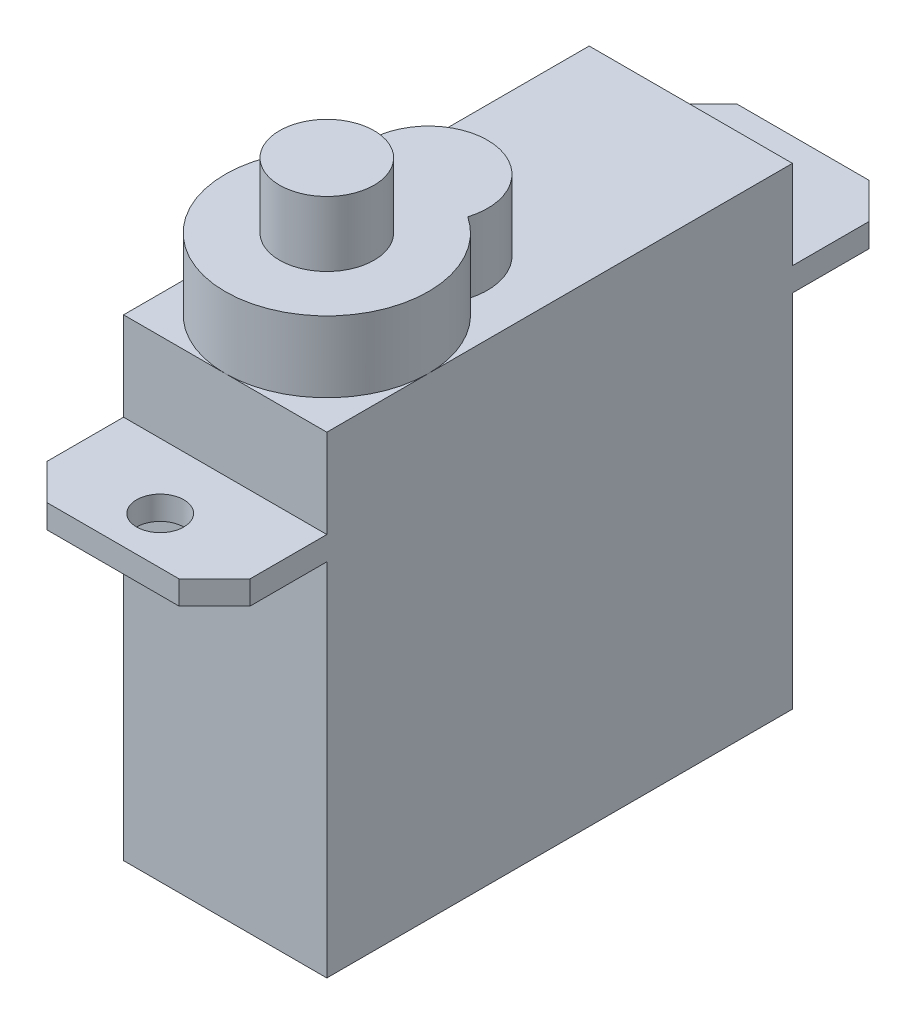
ISO-10303-21;
HEADER;
FILE_DESCRIPTION(('STEP AP214'),'2;1');
FILE_NAME('part.step','',(''),(''),'','','');
FILE_SCHEMA(('AUTOMOTIVE_DESIGN { 1 0 10303 214 1 1 1 1 }'));
ENDSEC;
DATA;
#1=APPLICATION_CONTEXT('core data for automotive mechanical design processes');
#2=APPLICATION_PROTOCOL_DEFINITION('international standard','automotive_design',2000,#1);
#3=PRODUCT_CONTEXT('',#1,'mechanical');
#4=PRODUCT('Part','Part','',(#3));
#5=PRODUCT_RELATED_PRODUCT_CATEGORY('part','',(#4));
#6=PRODUCT_DEFINITION_FORMATION('','',#4);
#7=PRODUCT_DEFINITION_CONTEXT('part definition',#1,'design');
#8=PRODUCT_DEFINITION('design','',#6,#7);
#9=PRODUCT_DEFINITION_SHAPE('','',#8);
#10=(LENGTH_UNIT() NAMED_UNIT(*) SI_UNIT(.MILLI.,.METRE.));
#11=(NAMED_UNIT(*) PLANE_ANGLE_UNIT() SI_UNIT($,.RADIAN.));
#12=(NAMED_UNIT(*) SI_UNIT($,.STERADIAN.) SOLID_ANGLE_UNIT());
#13=UNCERTAINTY_MEASURE_WITH_UNIT(LENGTH_MEASURE(1.E-05),#10,'distance_accuracy_value','');
#14=(GEOMETRIC_REPRESENTATION_CONTEXT(3) GLOBAL_UNCERTAINTY_ASSIGNED_CONTEXT((#13)) GLOBAL_UNIT_ASSIGNED_CONTEXT((#10,
#11,#12)) REPRESENTATION_CONTEXT('',''));
#15=CARTESIAN_POINT('',(0.,0.,0.));
#16=DIRECTION('',(0.,0.,1.));
#17=DIRECTION('',(1.,0.,0.));
#18=AXIS2_PLACEMENT_3D('',#15,#16,#17);
#19=CARTESIAN_POINT('',(8.6,-4.75,-9.85));
#20=DIRECTION('',(0.,1.,0.));
#21=DIRECTION('',(0.,0.,1.));
#22=AXIS2_PLACEMENT_3D('',#19,#20,#21);
#23=PLANE('',#22);
#24=DIRECTION('',(0.,0.,-1.));
#25=VECTOR('',#24,1.);
#26=CARTESIAN_POINT('',(0.,-4.75,-9.85));
#27=LINE('',#26,#25);
#28=CARTESIAN_POINT('',(0.,-4.75,-9.85));
#29=VERTEX_POINT('',#28);
#30=CARTESIAN_POINT('',(0.,-4.75,-13.1));
#31=VERTEX_POINT('',#30);
#32=EDGE_CURVE('E234',#29,#31,#27,.T.);
#33=ORIENTED_EDGE('',*,*,#32,.T.);
#34=DIRECTION('',(-0.707106781186546,0.,0.707106781186549));
#35=VECTOR('',#34,1.);
#36=CARTESIAN_POINT('',(1.5,-4.75,-14.6));
#37=LINE('',#36,#35);
#38=CARTESIAN_POINT('',(1.5,-4.75,-14.6));
#39=VERTEX_POINT('',#38);
#40=EDGE_CURVE('E296',#31,#39,#37,.F.);
#41=ORIENTED_EDGE('',*,*,#40,.T.);
#42=DIRECTION('',(-1.,0.,0.));
#43=VECTOR('',#42,1.);
#44=CARTESIAN_POINT('',(8.6,-4.75,-14.6));
#45=LINE('',#44,#43);
#46=CARTESIAN_POINT('',(7.1,-4.75,-14.6));
#47=VERTEX_POINT('',#46);
#48=EDGE_CURVE('E256',#47,#39,#45,.T.);
#49=ORIENTED_EDGE('',*,*,#48,.F.);
#50=DIRECTION('',(0.707106781186548,0.,0.707106781186547));
#51=VECTOR('',#50,1.);
#52=CARTESIAN_POINT('',(8.6,-4.75,-13.1));
#53=LINE('',#52,#51);
#54=CARTESIAN_POINT('',(8.6,-4.75,-13.1));
#55=VERTEX_POINT('',#54);
#56=EDGE_CURVE('E294',#47,#55,#53,.T.);
#57=ORIENTED_EDGE('',*,*,#56,.T.);
#58=DIRECTION('',(0.,0.,-1.));
#59=VECTOR('',#58,1.);
#60=CARTESIAN_POINT('',(8.6,-4.75,-9.85));
#61=LINE('',#60,#59);
#62=CARTESIAN_POINT('',(8.6,-4.75,-9.85));
#63=VERTEX_POINT('',#62);
#64=EDGE_CURVE('E213',#63,#55,#61,.T.);
#65=ORIENTED_EDGE('',*,*,#64,.F.);
#66=DIRECTION('',(-1.,0.,0.));
#67=VECTOR('',#66,1.);
#68=CARTESIAN_POINT('',(8.6,-4.75,-9.85));
#69=LINE('',#68,#67);
#70=EDGE_CURVE('E259',#63,#29,#69,.T.);
#71=ORIENTED_EDGE('',*,*,#70,.T.);
#72=EDGE_LOOP('',(#33,#41,#49,#57,#65,#71));
#73=FACE_BOUND('',#72,.T.);
#74=CARTESIAN_POINT('',(4.3,-4.75,-12.6));
#75=DIRECTION('',(0.,1.,0.));
#76=DIRECTION('',(0.,0.,1.));
#77=AXIS2_PLACEMENT_3D('',#74,#75,#76);
#78=CIRCLE('',#77,1.);
#79=CARTESIAN_POINT('',(4.3,-4.75,-11.6));
#80=VERTEX_POINT('',#79);
#81=EDGE_CURVE('E440',#80,#80,#78,.T.);
#82=ORIENTED_EDGE('',*,*,#81,.T.);
#83=EDGE_LOOP('',(#82));
#84=FACE_BOUND('',#83,.T.);
#85=ADVANCED_FACE('F35',(#73,#84),#23,.F.);
#86=CARTESIAN_POINT('',(8.6,-3.75,-9.85));
#87=DIRECTION('',(0.,-1.,0.));
#88=DIRECTION('',(0.,0.,-1.));
#89=AXIS2_PLACEMENT_3D('',#86,#87,#88);
#90=PLANE('',#89);
#91=DIRECTION('',(-1.,0.,0.));
#92=VECTOR('',#91,1.);
#93=CARTESIAN_POINT('',(8.6,-3.75,-14.6));
#94=LINE('',#93,#92);
#95=CARTESIAN_POINT('',(7.1,-3.75,-14.6));
#96=VERTEX_POINT('',#95);
#97=CARTESIAN_POINT('',(1.5,-3.75,-14.6));
#98=VERTEX_POINT('',#97);
#99=EDGE_CURVE('E253',#96,#98,#94,.T.);
#100=ORIENTED_EDGE('',*,*,#99,.T.);
#101=DIRECTION('',(0.707106781186546,0.,-0.707106781186549));
#102=VECTOR('',#101,1.);
#103=CARTESIAN_POINT('',(1.5,-3.75,-14.6));
#104=LINE('',#103,#102);
#105=CARTESIAN_POINT('',(0.,-3.75,-13.1));
#106=VERTEX_POINT('',#105);
#107=EDGE_CURVE('E288',#98,#106,#104,.F.);
#108=ORIENTED_EDGE('',*,*,#107,.T.);
#109=DIRECTION('',(0.,0.,1.));
#110=VECTOR('',#109,1.);
#111=CARTESIAN_POINT('',(0.,-3.75,-9.85));
#112=LINE('',#111,#110);
#113=CARTESIAN_POINT('',(0.,-3.75,-9.85));
#114=VERTEX_POINT('',#113);
#115=EDGE_CURVE('E237',#106,#114,#112,.T.);
#116=ORIENTED_EDGE('',*,*,#115,.T.);
#117=DIRECTION('',(-1.,0.,0.));
#118=VECTOR('',#117,1.);
#119=CARTESIAN_POINT('',(8.6,-3.75,-9.85));
#120=LINE('',#119,#118);
#121=CARTESIAN_POINT('',(8.6,-3.75,-9.85));
#122=VERTEX_POINT('',#121);
#123=EDGE_CURVE('E250',#122,#114,#120,.T.);
#124=ORIENTED_EDGE('',*,*,#123,.F.);
#125=DIRECTION('',(0.,0.,1.));
#126=VECTOR('',#125,1.);
#127=CARTESIAN_POINT('',(8.6,-3.75,-9.85));
#128=LINE('',#127,#126);
#129=CARTESIAN_POINT('',(8.6,-3.75,-13.1));
#130=VERTEX_POINT('',#129);
#131=EDGE_CURVE('E216',#130,#122,#128,.T.);
#132=ORIENTED_EDGE('',*,*,#131,.F.);
#133=DIRECTION('',(-0.707106781186548,0.,-0.707106781186547));
#134=VECTOR('',#133,1.);
#135=CARTESIAN_POINT('',(8.6,-3.75,-13.1));
#136=LINE('',#135,#134);
#137=EDGE_CURVE('E286',#130,#96,#136,.T.);
#138=ORIENTED_EDGE('',*,*,#137,.T.);
#139=EDGE_LOOP('',(#100,#108,#116,#124,#132,#138));
#140=FACE_BOUND('',#139,.T.);
#141=CARTESIAN_POINT('',(4.3,-3.75,-12.6));
#142=DIRECTION('',(0.,-1.,0.));
#143=DIRECTION('',(0.,0.,-1.));
#144=AXIS2_PLACEMENT_3D('',#141,#142,#143);
#145=CIRCLE('',#144,1.);
#146=CARTESIAN_POINT('',(4.3,-3.75,-13.6));
#147=VERTEX_POINT('',#146);
#148=EDGE_CURVE('E439',#147,#147,#145,.T.);
#149=ORIENTED_EDGE('',*,*,#148,.T.);
#150=EDGE_LOOP('',(#149));
#151=FACE_BOUND('',#150,.T.);
#152=ADVANCED_FACE('F346',(#140,#151),#90,.F.);
#153=CARTESIAN_POINT('',(4.3,3.,3.4));
#154=DIRECTION('',(0.,1.,0.));
#155=DIRECTION('',(0.,0.,1.));
#156=AXIS2_PLACEMENT_3D('',#153,#154,#155);
#157=PLANE('',#156);
#158=CARTESIAN_POINT('',(4.3,3.,1.25));
#159=DIRECTION('',(0.,1.,0.));
#160=DIRECTION('',(0.,0.,1.));
#161=AXIS2_PLACEMENT_3D('',#158,#159,#160);
#162=CIRCLE('',#161,2.5);
#163=CARTESIAN_POINT('',(6.69203739269427,3.,1.97674418604651));
#164=VERTEX_POINT('',#163);
#165=CARTESIAN_POINT('',(1.90796260730573,3.,1.97674418604651));
#166=VERTEX_POINT('',#165);
#167=EDGE_CURVE('E181',#164,#166,#162,.T.);
#168=ORIENTED_EDGE('',*,*,#167,.T.);
#169=CARTESIAN_POINT('',(4.3,3.,5.55));
#170=DIRECTION('',(0.,1.,0.));
#171=DIRECTION('',(0.,0.,1.));
#172=AXIS2_PLACEMENT_3D('',#169,#170,#171);
#173=CIRCLE('',#172,4.3);
#174=EDGE_CURVE('E169',#166,#164,#173,.T.);
#175=ORIENTED_EDGE('',*,*,#174,.T.);
#176=EDGE_LOOP('',(#168,#175));
#177=FACE_BOUND('',#176,.T.);
#178=CARTESIAN_POINT('',(4.3,3.,5.55));
#179=DIRECTION('',(0.,1.,0.));
#180=DIRECTION('',(0.,0.,1.));
#181=AXIS2_PLACEMENT_3D('',#178,#179,#180);
#182=CIRCLE('',#181,2.);
#183=CARTESIAN_POINT('',(4.3,3.,7.55));
#184=VERTEX_POINT('',#183);
#185=EDGE_CURVE('E428',#184,#184,#182,.T.);
#186=ORIENTED_EDGE('',*,*,#185,.F.);
#187=EDGE_LOOP('',(#186));
#188=FACE_BOUND('',#187,.T.);
#189=ADVANCED_FACE('F183',(#177,#188),#157,.T.);
#190=CARTESIAN_POINT('',(8.6,0.,9.85));
#191=DIRECTION('',(0.,-1.,0.));
#192=DIRECTION('',(0.,0.,-1.));
#193=AXIS2_PLACEMENT_3D('',#190,#191,#192);
#194=PLANE('',#193);
#195=CARTESIAN_POINT('',(4.3,0.,1.25));
#196=DIRECTION('',(0.,1.,0.));
#197=DIRECTION('',(0.,0.,1.));
#198=AXIS2_PLACEMENT_3D('',#195,#196,#197);
#199=CIRCLE('',#198,2.5);
#200=CARTESIAN_POINT('',(6.69203739269427,0.,1.97674418604651));
#201=VERTEX_POINT('',#200);
#202=CARTESIAN_POINT('',(1.90796260730573,0.,1.97674418604651));
#203=VERTEX_POINT('',#202);
#204=EDGE_CURVE('E189',#201,#203,#199,.T.);
#205=ORIENTED_EDGE('',*,*,#204,.F.);
#206=CARTESIAN_POINT('',(4.3,0.,5.55));
#207=DIRECTION('',(0.,1.,0.));
#208=DIRECTION('',(0.,0.,1.));
#209=AXIS2_PLACEMENT_3D('',#206,#207,#208);
#210=CIRCLE('',#209,4.3);
#211=CARTESIAN_POINT('',(8.6,0.,5.55));
#212=VERTEX_POINT('',#211);
#213=EDGE_CURVE('E279',#212,#201,#210,.T.);
#214=ORIENTED_EDGE('',*,*,#213,.F.);
#215=DIRECTION('',(0.,0.,1.));
#216=VECTOR('',#215,1.);
#217=CARTESIAN_POINT('',(8.6,0.,9.85));
#218=LINE('',#217,#216);
#219=CARTESIAN_POINT('',(8.6,0.,-9.85));
#220=VERTEX_POINT('',#219);
#221=EDGE_CURVE('E221',#220,#212,#218,.T.);
#222=ORIENTED_EDGE('',*,*,#221,.F.);
#223=DIRECTION('',(-1.,0.,0.));
#224=VECTOR('',#223,1.);
#225=CARTESIAN_POINT('',(8.6,0.,-9.85));
#226=LINE('',#225,#224);
#227=CARTESIAN_POINT('',(0.,0.,-9.85));
#228=VERTEX_POINT('',#227);
#229=EDGE_CURVE('E247',#220,#228,#226,.T.);
#230=ORIENTED_EDGE('',*,*,#229,.T.);
#231=DIRECTION('',(0.,0.,1.));
#232=VECTOR('',#231,1.);
#233=CARTESIAN_POINT('',(0.,0.,9.85));
#234=LINE('',#233,#232);
#235=CARTESIAN_POINT('',(0.,0.,5.55));
#236=VERTEX_POINT('',#235);
#237=EDGE_CURVE('E202',#228,#236,#234,.T.);
#238=ORIENTED_EDGE('',*,*,#237,.T.);
#239=EDGE_CURVE('E186',#203,#236,#210,.T.);
#240=ORIENTED_EDGE('',*,*,#239,.F.);
#241=EDGE_LOOP('',(#205,#214,#222,#230,#238,#240));
#242=FACE_BOUND('',#241,.T.);
#243=ADVANCED_FACE('F418',(#242),#194,.F.);
#244=CARTESIAN_POINT('',(4.3,0.,9.85));
#245=VERTEX_POINT('',#244);
#246=EDGE_CURVE('E283',#236,#245,#210,.T.);
#247=ORIENTED_EDGE('',*,*,#246,.F.);
#248=CARTESIAN_POINT('',(0.,0.,9.85));
#249=VERTEX_POINT('',#248);
#250=EDGE_CURVE('E241',#236,#249,#234,.T.);
#251=ORIENTED_EDGE('',*,*,#250,.T.);
#252=DIRECTION('',(-1.,0.,0.));
#253=VECTOR('',#252,1.);
#254=CARTESIAN_POINT('',(8.6,0.,9.85));
#255=LINE('',#254,#253);
#256=EDGE_CURVE('E223',#245,#249,#255,.T.);
#257=ORIENTED_EDGE('',*,*,#256,.F.);
#258=EDGE_LOOP('',(#247,#251,#257));
#259=FACE_BOUND('',#258,.T.);
#260=ADVANCED_FACE('F477',(#259),#194,.F.);
#261=EDGE_CURVE('E420',#245,#212,#210,.T.);
#262=ORIENTED_EDGE('',*,*,#261,.F.);
#263=CARTESIAN_POINT('',(8.6,0.,9.85));
#264=VERTEX_POINT('',#263);
#265=EDGE_CURVE('E244',#264,#245,#255,.T.);
#266=ORIENTED_EDGE('',*,*,#265,.F.);
#267=EDGE_CURVE('E220',#212,#264,#218,.T.);
#268=ORIENTED_EDGE('',*,*,#267,.F.);
#269=EDGE_LOOP('',(#262,#266,#268));
#270=FACE_BOUND('',#269,.T.);
#271=ADVANCED_FACE('F380',(#270),#194,.F.);
#272=CARTESIAN_POINT('',(8.6,0.,9.85));
#273=DIRECTION('',(0.,0.,-1.));
#274=DIRECTION('',(0.,1.,0.));
#275=AXIS2_PLACEMENT_3D('',#272,#273,#274);
#276=PLANE('',#275);
#277=DIRECTION('',(0.,-1.,0.));
#278=VECTOR('',#277,1.);
#279=CARTESIAN_POINT('',(0.,0.,9.85));
#280=LINE('',#279,#278);
#281=CARTESIAN_POINT('',(0.,-3.75,9.85));
#282=VERTEX_POINT('',#281);
#283=EDGE_CURVE('E190',#249,#282,#280,.T.);
#284=ORIENTED_EDGE('',*,*,#283,.T.);
#285=DIRECTION('',(-1.,0.,0.));
#286=VECTOR('',#285,1.);
#287=CARTESIAN_POINT('',(8.6,-3.75,9.85));
#288=LINE('',#287,#286);
#289=CARTESIAN_POINT('',(8.6,-3.75,9.85));
#290=VERTEX_POINT('',#289);
#291=EDGE_CURVE('E276',#290,#282,#288,.T.);
#292=ORIENTED_EDGE('',*,*,#291,.F.);
#293=DIRECTION('',(0.,-1.,0.));
#294=VECTOR('',#293,1.);
#295=CARTESIAN_POINT('',(8.6,0.,9.85));
#296=LINE('',#295,#294);
#297=EDGE_CURVE('E198',#264,#290,#296,.T.);
#298=ORIENTED_EDGE('',*,*,#297,.F.);
#299=ORIENTED_EDGE('',*,*,#265,.T.);
#300=ORIENTED_EDGE('',*,*,#256,.T.);
#301=EDGE_LOOP('',(#284,#292,#298,#299,#300));
#302=FACE_BOUND('',#301,.T.);
#303=ADVANCED_FACE('F330',(#302),#276,.F.);
#304=CARTESIAN_POINT('',(8.6,-3.75,14.6));
#305=DIRECTION('',(0.,-1.,0.));
#306=DIRECTION('',(0.,0.,-1.));
#307=AXIS2_PLACEMENT_3D('',#304,#305,#306);
#308=PLANE('',#307);
#309=CARTESIAN_POINT('',(4.3,-3.75,12.6));
#310=DIRECTION('',(0.,1.,0.));
#311=DIRECTION('',(0.,0.,1.));
#312=AXIS2_PLACEMENT_3D('',#309,#310,#311);
#313=CIRCLE('',#312,1.);
#314=CARTESIAN_POINT('',(4.3,-3.75,13.6));
#315=VERTEX_POINT('',#314);
#316=EDGE_CURVE('E436',#315,#315,#313,.T.);
#317=ORIENTED_EDGE('',*,*,#316,.F.);
#318=EDGE_LOOP('',(#317));
#319=FACE_BOUND('',#318,.T.);
#320=DIRECTION('',(-1.,0.,0.));
#321=VECTOR('',#320,1.);
#322=CARTESIAN_POINT('',(8.6,-3.75,14.6));
#323=LINE('',#322,#321);
#324=CARTESIAN_POINT('',(7.1,-3.75,14.6));
#325=VERTEX_POINT('',#324);
#326=CARTESIAN_POINT('',(1.5,-3.75,14.6));
#327=VERTEX_POINT('',#326);
#328=EDGE_CURVE('E274',#325,#327,#323,.T.);
#329=ORIENTED_EDGE('',*,*,#328,.F.);
#330=DIRECTION('',(0.707106781186548,0.,-0.707106781186547));
#331=VECTOR('',#330,1.);
#332=CARTESIAN_POINT('',(8.6,-3.75,13.1));
#333=LINE('',#332,#331);
#334=CARTESIAN_POINT('',(8.6,-3.75,13.1));
#335=VERTEX_POINT('',#334);
#336=EDGE_CURVE('E11',#325,#335,#333,.T.);
#337=ORIENTED_EDGE('',*,*,#336,.T.);
#338=DIRECTION('',(0.,0.,1.));
#339=VECTOR('',#338,1.);
#340=CARTESIAN_POINT('',(8.6,-3.75,14.6));
#341=LINE('',#340,#339);
#342=EDGE_CURVE('E201',#290,#335,#341,.T.);
#343=ORIENTED_EDGE('',*,*,#342,.F.);
#344=ORIENTED_EDGE('',*,*,#291,.T.);
#345=DIRECTION('',(0.,0.,1.));
#346=VECTOR('',#345,1.);
#347=CARTESIAN_POINT('',(0.,-3.75,14.6));
#348=LINE('',#347,#346);
#349=CARTESIAN_POINT('',(0.,-3.75,13.1));
#350=VERTEX_POINT('',#349);
#351=EDGE_CURVE('E193',#282,#350,#348,.T.);
#352=ORIENTED_EDGE('',*,*,#351,.T.);
#353=DIRECTION('',(-0.707106781186546,0.,-0.707106781186549));
#354=VECTOR('',#353,1.);
#355=CARTESIAN_POINT('',(1.5,-3.75,14.6));
#356=LINE('',#355,#354);
#357=EDGE_CURVE('E43',#350,#327,#356,.F.);
#358=ORIENTED_EDGE('',*,*,#357,.T.);
#359=EDGE_LOOP('',(#329,#337,#343,#344,#352,#358));
#360=FACE_BOUND('',#359,.T.);
#361=ADVANCED_FACE('F327',(#319,#360),#308,.F.);
#362=CARTESIAN_POINT('',(8.6,-3.75,14.6));
#363=DIRECTION('',(0.,0.,-1.));
#364=DIRECTION('',(-1.,0.,0.));
#365=AXIS2_PLACEMENT_3D('',#362,#363,#364);
#366=PLANE('',#365);
#367=DIRECTION('',(-1.,0.,0.));
#368=VECTOR('',#367,1.);
#369=CARTESIAN_POINT('',(8.6,-4.75,14.6));
#370=LINE('',#369,#368);
#371=CARTESIAN_POINT('',(7.1,-4.75,14.6));
#372=VERTEX_POINT('',#371);
#373=CARTESIAN_POINT('',(1.5,-4.75,14.6));
#374=VERTEX_POINT('',#373);
#375=EDGE_CURVE('E271',#372,#374,#370,.T.);
#376=ORIENTED_EDGE('',*,*,#375,.F.);
#377=DIRECTION('',(0.,1.,0.));
#378=VECTOR('',#377,1.);
#379=CARTESIAN_POINT('',(7.1,-3.75,14.6));
#380=LINE('',#379,#378);
#381=EDGE_CURVE('E56',#372,#325,#380,.T.);
#382=ORIENTED_EDGE('',*,*,#381,.T.);
#383=ORIENTED_EDGE('',*,*,#328,.T.);
#384=DIRECTION('',(0.,-1.,0.));
#385=VECTOR('',#384,1.);
#386=CARTESIAN_POINT('',(1.5,-3.75,14.6));
#387=LINE('',#386,#385);
#388=EDGE_CURVE('E308',#327,#374,#387,.T.);
#389=ORIENTED_EDGE('',*,*,#388,.T.);
#390=EDGE_LOOP('',(#376,#382,#383,#389));
#391=FACE_BOUND('',#390,.T.);
#392=ADVANCED_FACE('F312',(#391),#366,.F.);
#393=CARTESIAN_POINT('',(8.6,-4.75,14.6));
#394=DIRECTION('',(0.,1.,0.));
#395=DIRECTION('',(0.,0.,1.));
#396=AXIS2_PLACEMENT_3D('',#393,#394,#395);
#397=PLANE('',#396);
#398=CARTESIAN_POINT('',(4.3,-4.75,12.6));
#399=DIRECTION('',(0.,1.,0.));
#400=DIRECTION('',(0.,0.,1.));
#401=AXIS2_PLACEMENT_3D('',#398,#399,#400);
#402=CIRCLE('',#401,1.);
#403=CARTESIAN_POINT('',(4.3,-4.75,13.6));
#404=VERTEX_POINT('',#403);
#405=EDGE_CURVE('E432',#404,#404,#402,.F.);
#406=ORIENTED_EDGE('',*,*,#405,.F.);
#407=EDGE_LOOP('',(#406));
#408=FACE_BOUND('',#407,.T.);
#409=DIRECTION('',(0.,0.,-1.));
#410=VECTOR('',#409,1.);
#411=CARTESIAN_POINT('',(8.6,-4.75,14.6));
#412=LINE('',#411,#410);
#413=CARTESIAN_POINT('',(8.6,-4.75,13.1));
#414=VERTEX_POINT('',#413);
#415=CARTESIAN_POINT('',(8.6,-4.75,9.85));
#416=VERTEX_POINT('',#415);
#417=EDGE_CURVE('E205',#414,#416,#412,.T.);
#418=ORIENTED_EDGE('',*,*,#417,.F.);
#419=DIRECTION('',(-0.707106781186548,0.,0.707106781186547));
#420=VECTOR('',#419,1.);
#421=CARTESIAN_POINT('',(8.6,-4.75,13.1));
#422=LINE('',#421,#420);
#423=EDGE_CURVE('E306',#414,#372,#422,.T.);
#424=ORIENTED_EDGE('',*,*,#423,.T.);
#425=ORIENTED_EDGE('',*,*,#375,.T.);
#426=DIRECTION('',(0.707106781186546,0.,0.707106781186549));
#427=VECTOR('',#426,1.);
#428=CARTESIAN_POINT('',(1.5,-4.75,14.6));
#429=LINE('',#428,#427);
#430=CARTESIAN_POINT('',(0.,-4.75,13.1));
#431=VERTEX_POINT('',#430);
#432=EDGE_CURVE('E304',#374,#431,#429,.F.);
#433=ORIENTED_EDGE('',*,*,#432,.T.);
#434=DIRECTION('',(0.,0.,-1.));
#435=VECTOR('',#434,1.);
#436=CARTESIAN_POINT('',(0.,-4.75,14.6));
#437=LINE('',#436,#435);
#438=CARTESIAN_POINT('',(0.,-4.75,9.85));
#439=VERTEX_POINT('',#438);
#440=EDGE_CURVE('E226',#431,#439,#437,.T.);
#441=ORIENTED_EDGE('',*,*,#440,.T.);
#442=DIRECTION('',(-1.,0.,0.));
#443=VECTOR('',#442,1.);
#444=CARTESIAN_POINT('',(8.6,-4.75,9.85));
#445=LINE('',#444,#443);
#446=EDGE_CURVE('E268',#416,#439,#445,.T.);
#447=ORIENTED_EDGE('',*,*,#446,.F.);
#448=EDGE_LOOP('',(#418,#424,#425,#433,#441,#447));
#449=FACE_BOUND('',#448,.T.);
#450=ADVANCED_FACE('F316',(#408,#449),#397,.F.);
#451=CARTESIAN_POINT('',(8.6,-4.75,9.85));
#452=DIRECTION('',(0.,0.,-1.));
#453=DIRECTION('',(0.,1.,0.));
#454=AXIS2_PLACEMENT_3D('',#451,#452,#453);
#455=PLANE('',#454);
#456=DIRECTION('',(0.,-1.,0.));
#457=VECTOR('',#456,1.);
#458=CARTESIAN_POINT('',(0.,-4.75,9.85));
#459=LINE('',#458,#457);
#460=CARTESIAN_POINT('',(0.,-20.,9.85));
#461=VERTEX_POINT('',#460);
#462=EDGE_CURVE('E228',#439,#461,#459,.T.);
#463=ORIENTED_EDGE('',*,*,#462,.T.);
#464=DIRECTION('',(-1.,0.,0.));
#465=VECTOR('',#464,1.);
#466=CARTESIAN_POINT('',(8.6,-20.,9.85));
#467=LINE('',#466,#465);
#468=CARTESIAN_POINT('',(8.6,-20.,9.85));
#469=VERTEX_POINT('',#468);
#470=EDGE_CURVE('E265',#469,#461,#467,.T.);
#471=ORIENTED_EDGE('',*,*,#470,.F.);
#472=DIRECTION('',(0.,-1.,0.));
#473=VECTOR('',#472,1.);
#474=CARTESIAN_POINT('',(8.6,-4.75,9.85));
#475=LINE('',#474,#473);
#476=EDGE_CURVE('E207',#416,#469,#475,.T.);
#477=ORIENTED_EDGE('',*,*,#476,.F.);
#478=ORIENTED_EDGE('',*,*,#446,.T.);
#479=EDGE_LOOP('',(#463,#471,#477,#478));
#480=FACE_BOUND('',#479,.T.);
#481=ADVANCED_FACE('F365',(#480),#455,.F.);
#482=CARTESIAN_POINT('',(8.6,-20.,9.85));
#483=DIRECTION('',(0.,1.,0.));
#484=DIRECTION('',(0.,0.,1.));
#485=AXIS2_PLACEMENT_3D('',#482,#483,#484);
#486=PLANE('',#485);
#487=DIRECTION('',(0.,0.,-1.));
#488=VECTOR('',#487,1.);
#489=CARTESIAN_POINT('',(0.,-20.,9.85));
#490=LINE('',#489,#488);
#491=CARTESIAN_POINT('',(0.,-20.,-9.85));
#492=VERTEX_POINT('',#491);
#493=EDGE_CURVE('E230',#461,#492,#490,.T.);
#494=ORIENTED_EDGE('',*,*,#493,.T.);
#495=DIRECTION('',(-1.,0.,0.));
#496=VECTOR('',#495,1.);
#497=CARTESIAN_POINT('',(8.6,-20.,-9.85));
#498=LINE('',#497,#496);
#499=CARTESIAN_POINT('',(8.6,-20.,-9.85));
#500=VERTEX_POINT('',#499);
#501=EDGE_CURVE('E262',#500,#492,#498,.T.);
#502=ORIENTED_EDGE('',*,*,#501,.F.);
#503=DIRECTION('',(0.,0.,-1.));
#504=VECTOR('',#503,1.);
#505=CARTESIAN_POINT('',(8.6,-20.,9.85));
#506=LINE('',#505,#504);
#507=EDGE_CURVE('E209',#469,#500,#506,.T.);
#508=ORIENTED_EDGE('',*,*,#507,.F.);
#509=ORIENTED_EDGE('',*,*,#470,.T.);
#510=EDGE_LOOP('',(#494,#502,#508,#509));
#511=FACE_BOUND('',#510,.T.);
#512=ADVANCED_FACE('F361',(#511),#486,.F.);
#513=CARTESIAN_POINT('',(8.6,-4.75,-9.85));
#514=DIRECTION('',(0.,0.,1.));
#515=DIRECTION('',(0.,-1.,0.));
#516=AXIS2_PLACEMENT_3D('',#513,#514,#515);
#517=PLANE('',#516);
#518=DIRECTION('',(0.,1.,0.));
#519=VECTOR('',#518,1.);
#520=CARTESIAN_POINT('',(0.,-4.75,-9.85));
#521=LINE('',#520,#519);
#522=EDGE_CURVE('E232',#492,#29,#521,.T.);
#523=ORIENTED_EDGE('',*,*,#522,.T.);
#524=ORIENTED_EDGE('',*,*,#70,.F.);
#525=DIRECTION('',(0.,1.,0.));
#526=VECTOR('',#525,1.);
#527=CARTESIAN_POINT('',(8.6,-4.75,-9.85));
#528=LINE('',#527,#526);
#529=EDGE_CURVE('E211',#500,#63,#528,.T.);
#530=ORIENTED_EDGE('',*,*,#529,.F.);
#531=ORIENTED_EDGE('',*,*,#501,.T.);
#532=EDGE_LOOP('',(#523,#524,#530,#531));
#533=FACE_BOUND('',#532,.T.);
#534=ADVANCED_FACE('F358',(#533),#517,.F.);
#535=CARTESIAN_POINT('',(8.6,-3.75,-14.6));
#536=DIRECTION('',(0.,0.,1.));
#537=DIRECTION('',(1.,0.,0.));
#538=AXIS2_PLACEMENT_3D('',#535,#536,#537);
#539=PLANE('',#538);
#540=ORIENTED_EDGE('',*,*,#48,.T.);
#541=DIRECTION('',(0.,1.,0.));
#542=VECTOR('',#541,1.);
#543=CARTESIAN_POINT('',(1.5,-3.75,-14.6));
#544=LINE('',#543,#542);
#545=EDGE_CURVE('E282',#39,#98,#544,.T.);
#546=ORIENTED_EDGE('',*,*,#545,.T.);
#547=ORIENTED_EDGE('',*,*,#99,.F.);
#548=DIRECTION('',(0.,-1.,0.));
#549=VECTOR('',#548,1.);
#550=CARTESIAN_POINT('',(7.1,-4.75,-14.6));
#551=LINE('',#550,#549);
#552=EDGE_CURVE('E280',#96,#47,#551,.T.);
#553=ORIENTED_EDGE('',*,*,#552,.T.);
#554=EDGE_LOOP('',(#540,#546,#547,#553));
#555=FACE_BOUND('',#554,.T.);
#556=ADVANCED_FACE('F357',(#555),#539,.F.);
#557=CARTESIAN_POINT('',(8.6,0.,-9.85));
#558=DIRECTION('',(0.,0.,1.));
#559=DIRECTION('',(0.,-1.,0.));
#560=AXIS2_PLACEMENT_3D('',#557,#558,#559);
#561=PLANE('',#560);
#562=DIRECTION('',(0.,1.,0.));
#563=VECTOR('',#562,1.);
#564=CARTESIAN_POINT('',(0.,0.,-9.85));
#565=LINE('',#564,#563);
#566=EDGE_CURVE('E239',#114,#228,#565,.T.);
#567=ORIENTED_EDGE('',*,*,#566,.T.);
#568=ORIENTED_EDGE('',*,*,#229,.F.);
#569=DIRECTION('',(0.,1.,0.));
#570=VECTOR('',#569,1.);
#571=CARTESIAN_POINT('',(8.6,0.,-9.85));
#572=LINE('',#571,#570);
#573=EDGE_CURVE('E218',#122,#220,#572,.T.);
#574=ORIENTED_EDGE('',*,*,#573,.F.);
#575=ORIENTED_EDGE('',*,*,#123,.T.);
#576=EDGE_LOOP('',(#567,#568,#574,#575));
#577=FACE_BOUND('',#576,.T.);
#578=ADVANCED_FACE('F416',(#577),#561,.F.);
#579=CARTESIAN_POINT('',(8.6,0.,0.));
#580=DIRECTION('',(1.,0.,0.));
#581=DIRECTION('',(0.,0.,-1.));
#582=AXIS2_PLACEMENT_3D('',#579,#580,#581);
#583=PLANE('',#582);
#584=ORIENTED_EDGE('',*,*,#64,.T.);
#585=DIRECTION('',(0.,1.,0.));
#586=VECTOR('',#585,1.);
#587=CARTESIAN_POINT('',(8.6,-3.75,-13.1));
#588=LINE('',#587,#586);
#589=EDGE_CURVE('E301',#55,#130,#588,.T.);
#590=ORIENTED_EDGE('',*,*,#589,.T.);
#591=ORIENTED_EDGE('',*,*,#131,.T.);
#592=ORIENTED_EDGE('',*,*,#573,.T.);
#593=ORIENTED_EDGE('',*,*,#221,.T.);
#594=ORIENTED_EDGE('',*,*,#267,.T.);
#595=ORIENTED_EDGE('',*,*,#297,.T.);
#596=ORIENTED_EDGE('',*,*,#342,.T.);
#597=DIRECTION('',(0.,-1.,0.));
#598=VECTOR('',#597,1.);
#599=CARTESIAN_POINT('',(8.6,-4.75,13.1));
#600=LINE('',#599,#598);
#601=EDGE_CURVE('E298',#335,#414,#600,.T.);
#602=ORIENTED_EDGE('',*,*,#601,.T.);
#603=ORIENTED_EDGE('',*,*,#417,.T.);
#604=ORIENTED_EDGE('',*,*,#476,.T.);
#605=ORIENTED_EDGE('',*,*,#507,.T.);
#606=ORIENTED_EDGE('',*,*,#529,.T.);
#607=EDGE_LOOP('',(#584,#590,#591,#592,#593,#594,#595,#596,#602,#603,#604,#605,#606));
#608=FACE_BOUND('',#607,.T.);
#609=ADVANCED_FACE('F324',(#608),#583,.T.);
#610=CARTESIAN_POINT('',(0.,0.,0.));
#611=DIRECTION('',(1.,0.,0.));
#612=DIRECTION('',(0.,0.,-1.));
#613=AXIS2_PLACEMENT_3D('',#610,#611,#612);
#614=PLANE('',#613);
#615=ORIENTED_EDGE('',*,*,#115,.F.);
#616=DIRECTION('',(0.,-1.,0.));
#617=VECTOR('',#616,1.);
#618=CARTESIAN_POINT('',(0.,0.,-13.1));
#619=LINE('',#618,#617);
#620=EDGE_CURVE('E292',#106,#31,#619,.T.);
#621=ORIENTED_EDGE('',*,*,#620,.T.);
#622=ORIENTED_EDGE('',*,*,#32,.F.);
#623=ORIENTED_EDGE('',*,*,#522,.F.);
#624=ORIENTED_EDGE('',*,*,#493,.F.);
#625=ORIENTED_EDGE('',*,*,#462,.F.);
#626=ORIENTED_EDGE('',*,*,#440,.F.);
#627=DIRECTION('',(0.,1.,0.));
#628=VECTOR('',#627,1.);
#629=CARTESIAN_POINT('',(0.,0.,13.1));
#630=LINE('',#629,#628);
#631=EDGE_CURVE('E290',#431,#350,#630,.T.);
#632=ORIENTED_EDGE('',*,*,#631,.T.);
#633=ORIENTED_EDGE('',*,*,#351,.F.);
#634=ORIENTED_EDGE('',*,*,#283,.F.);
#635=ORIENTED_EDGE('',*,*,#250,.F.);
#636=ORIENTED_EDGE('',*,*,#237,.F.);
#637=ORIENTED_EDGE('',*,*,#566,.F.);
#638=EDGE_LOOP('',(#615,#621,#622,#623,#624,#625,#626,#632,#633,#634,#635,#636,#637));
#639=FACE_BOUND('',#638,.T.);
#640=ADVANCED_FACE('F336',(#639),#614,.F.);
#641=CARTESIAN_POINT('',(4.3,3.,1.25));
#642=DIRECTION('',(0.,-1.,0.));
#643=DIRECTION('',(0.,0.,-1.));
#644=AXIS2_PLACEMENT_3D('',#641,#642,#643);
#645=CYLINDRICAL_SURFACE('',#644,2.5);
#646=ORIENTED_EDGE('',*,*,#204,.T.);
#647=DIRECTION('',(0.,-1.,0.));
#648=VECTOR('',#647,1.);
#649=CARTESIAN_POINT('',(1.90796260730573,3.,1.97674418604651));
#650=LINE('',#649,#648);
#651=EDGE_CURVE('E174',#166,#203,#650,.T.);
#652=ORIENTED_EDGE('',*,*,#651,.F.);
#653=ORIENTED_EDGE('',*,*,#167,.F.);
#654=DIRECTION('',(0.,-1.,0.));
#655=VECTOR('',#654,1.);
#656=CARTESIAN_POINT('',(6.69203739269427,3.,1.97674418604651));
#657=LINE('',#656,#655);
#658=EDGE_CURVE('E178',#164,#201,#657,.T.);
#659=ORIENTED_EDGE('',*,*,#658,.T.);
#660=EDGE_LOOP('',(#646,#652,#653,#659));
#661=FACE_BOUND('',#660,.T.);
#662=ADVANCED_FACE('F188',(#661),#645,.T.);
#663=CARTESIAN_POINT('',(4.3,3.,5.55));
#664=DIRECTION('',(0.,-1.,0.));
#665=DIRECTION('',(0.,0.,-1.));
#666=AXIS2_PLACEMENT_3D('',#663,#664,#665);
#667=CYLINDRICAL_SURFACE('',#666,4.3);
#668=ORIENTED_EDGE('',*,*,#239,.T.);
#669=ORIENTED_EDGE('',*,*,#246,.T.);
#670=ORIENTED_EDGE('',*,*,#261,.T.);
#671=ORIENTED_EDGE('',*,*,#213,.T.);
#672=ORIENTED_EDGE('',*,*,#658,.F.);
#673=ORIENTED_EDGE('',*,*,#174,.F.);
#674=ORIENTED_EDGE('',*,*,#651,.T.);
#675=EDGE_LOOP('',(#668,#669,#670,#671,#672,#673,#674));
#676=FACE_BOUND('',#675,.T.);
#677=ADVANCED_FACE('F172',(#676),#667,.T.);
#678=CARTESIAN_POINT('',(4.3,5.75,5.55));
#679=DIRECTION('',(0.,-1.,0.));
#680=DIRECTION('',(0.,0.,-1.));
#681=AXIS2_PLACEMENT_3D('',#678,#679,#680);
#682=CYLINDRICAL_SURFACE('',#681,2.);
#683=CARTESIAN_POINT('',(4.3,5.75,5.55));
#684=DIRECTION('',(0.,1.,0.));
#685=DIRECTION('',(0.,0.,1.));
#686=AXIS2_PLACEMENT_3D('',#683,#684,#685);
#687=CIRCLE('',#686,2.);
#688=CARTESIAN_POINT('',(4.3,5.75,7.55));
#689=VERTEX_POINT('',#688);
#690=EDGE_CURVE('E426',#689,#689,#687,.T.);
#691=ORIENTED_EDGE('',*,*,#690,.F.);
#692=EDGE_LOOP('',(#691));
#693=FACE_BOUND('',#692,.T.);
#694=ORIENTED_EDGE('',*,*,#185,.T.);
#695=EDGE_LOOP('',(#694));
#696=FACE_BOUND('',#695,.T.);
#697=ADVANCED_FACE('F460',(#693,#696),#682,.T.);
#698=CARTESIAN_POINT('',(4.3,5.75,5.55));
#699=DIRECTION('',(0.,1.,0.));
#700=DIRECTION('',(0.,0.,1.));
#701=AXIS2_PLACEMENT_3D('',#698,#699,#700);
#702=PLANE('',#701);
#703=ORIENTED_EDGE('',*,*,#690,.T.);
#704=EDGE_LOOP('',(#703));
#705=FACE_BOUND('',#704,.T.);
#706=ADVANCED_FACE('F454',(#705),#702,.T.);
#707=CARTESIAN_POINT('',(4.3,-20.001,12.6));
#708=DIRECTION('',(0.,1.,0.));
#709=DIRECTION('',(0.,0.,1.));
#710=AXIS2_PLACEMENT_3D('',#707,#708,#709);
#711=CYLINDRICAL_SURFACE('',#710,1.);
#712=ORIENTED_EDGE('',*,*,#316,.T.);
#713=EDGE_LOOP('',(#712));
#714=FACE_BOUND('',#713,.T.);
#715=ORIENTED_EDGE('',*,*,#405,.T.);
#716=EDGE_LOOP('',(#715));
#717=FACE_BOUND('',#716,.T.);
#718=ADVANCED_FACE('F448',(#714,#717),#711,.F.);
#719=CARTESIAN_POINT('',(4.3,-20.001,-12.6));
#720=DIRECTION('',(0.,1.,0.));
#721=DIRECTION('',(0.,0.,1.));
#722=AXIS2_PLACEMENT_3D('',#719,#720,#721);
#723=CYLINDRICAL_SURFACE('',#722,1.);
#724=ORIENTED_EDGE('',*,*,#148,.F.);
#725=EDGE_LOOP('',(#724));
#726=FACE_BOUND('',#725,.T.);
#727=ORIENTED_EDGE('',*,*,#81,.F.);
#728=EDGE_LOOP('',(#727));
#729=FACE_BOUND('',#728,.T.);
#730=ADVANCED_FACE('F384',(#726,#729),#723,.F.);
#731=CARTESIAN_POINT('',(1.5,-3.75,-14.6));
#732=DIRECTION('',(0.707106781186549,0.,0.707106781186546));
#733=DIRECTION('',(0.,1.,0.));
#734=AXIS2_PLACEMENT_3D('',#731,#732,#733);
#735=PLANE('',#734);
#736=ORIENTED_EDGE('',*,*,#40,.F.);
#737=ORIENTED_EDGE('',*,*,#620,.F.);
#738=ORIENTED_EDGE('',*,*,#107,.F.);
#739=ORIENTED_EDGE('',*,*,#545,.F.);
#740=EDGE_LOOP('',(#736,#737,#738,#739));
#741=FACE_BOUND('',#740,.T.);
#742=ADVANCED_FACE('F381',(#741),#735,.F.);
#743=CARTESIAN_POINT('',(8.6,0.,-13.1));
#744=DIRECTION('',(0.707106781186547,0.,-0.707106781186548));
#745=DIRECTION('',(0.,-1.,0.));
#746=AXIS2_PLACEMENT_3D('',#743,#744,#745);
#747=PLANE('',#746);
#748=ORIENTED_EDGE('',*,*,#56,.F.);
#749=ORIENTED_EDGE('',*,*,#552,.F.);
#750=ORIENTED_EDGE('',*,*,#137,.F.);
#751=ORIENTED_EDGE('',*,*,#589,.F.);
#752=EDGE_LOOP('',(#748,#749,#750,#751));
#753=FACE_BOUND('',#752,.T.);
#754=ADVANCED_FACE('F344',(#753),#747,.T.);
#755=CARTESIAN_POINT('',(8.6,0.,13.1));
#756=DIRECTION('',(0.707106781186547,0.,0.707106781186548));
#757=DIRECTION('',(0.,1.,0.));
#758=AXIS2_PLACEMENT_3D('',#755,#756,#757);
#759=PLANE('',#758);
#760=ORIENTED_EDGE('',*,*,#336,.F.);
#761=ORIENTED_EDGE('',*,*,#381,.F.);
#762=ORIENTED_EDGE('',*,*,#423,.F.);
#763=ORIENTED_EDGE('',*,*,#601,.F.);
#764=EDGE_LOOP('',(#760,#761,#762,#763));
#765=FACE_BOUND('',#764,.T.);
#766=ADVANCED_FACE('F322',(#765),#759,.T.);
#767=CARTESIAN_POINT('',(1.5,-3.75,14.6));
#768=DIRECTION('',(0.707106781186549,0.,-0.707106781186546));
#769=DIRECTION('',(0.,-1.,0.));
#770=AXIS2_PLACEMENT_3D('',#767,#768,#769);
#771=PLANE('',#770);
#772=ORIENTED_EDGE('',*,*,#357,.F.);
#773=ORIENTED_EDGE('',*,*,#631,.F.);
#774=ORIENTED_EDGE('',*,*,#432,.F.);
#775=ORIENTED_EDGE('',*,*,#388,.F.);
#776=EDGE_LOOP('',(#772,#773,#774,#775));
#777=FACE_BOUND('',#776,.T.);
#778=ADVANCED_FACE('F37',(#777),#771,.F.);
#779=CLOSED_SHELL('',(#85,#152,#189,#243,#260,#271,#303,#361,#392,#450,#481,#512,#534,#556,#578,
#609,#640,#662,#677,#697,#706,#718,#730,#742,#754,#766,#778));
#780=MANIFOLD_SOLID_BREP('B2',#779);
#781=ADVANCED_BREP_SHAPE_REPRESENTATION('',(#18,#780),#14);
#782=SHAPE_DEFINITION_REPRESENTATION(#9,#781);
ENDSEC;
END-ISO-10303-21;
